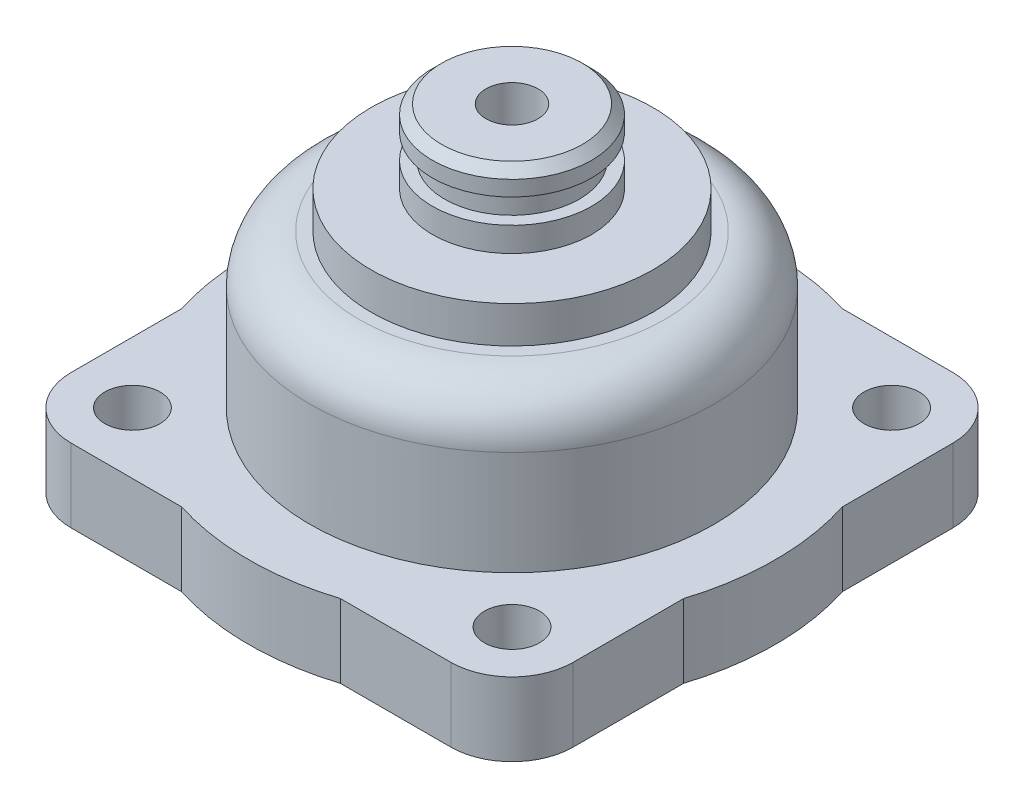
ISO-10303-21;
HEADER;
FILE_DESCRIPTION(('STEP AP214'),'2;1');
FILE_NAME('part.step','',(''),(''),'','','');
FILE_SCHEMA(('AUTOMOTIVE_DESIGN { 1 0 10303 214 1 1 1 1 }'));
ENDSEC;
DATA;
#1=APPLICATION_CONTEXT('core data for automotive mechanical design processes');
#2=APPLICATION_PROTOCOL_DEFINITION('international standard','automotive_design',2000,#1);
#3=PRODUCT_CONTEXT('',#1,'mechanical');
#4=PRODUCT('Part','Part','',(#3));
#5=PRODUCT_RELATED_PRODUCT_CATEGORY('part','',(#4));
#6=PRODUCT_DEFINITION_FORMATION('','',#4);
#7=PRODUCT_DEFINITION_CONTEXT('part definition',#1,'design');
#8=PRODUCT_DEFINITION('design','',#6,#7);
#9=PRODUCT_DEFINITION_SHAPE('','',#8);
#10=(LENGTH_UNIT() NAMED_UNIT(*) SI_UNIT(.MILLI.,.METRE.));
#11=(NAMED_UNIT(*) PLANE_ANGLE_UNIT() SI_UNIT($,.RADIAN.));
#12=(NAMED_UNIT(*) SI_UNIT($,.STERADIAN.) SOLID_ANGLE_UNIT());
#13=UNCERTAINTY_MEASURE_WITH_UNIT(LENGTH_MEASURE(1.E-05),#10,'distance_accuracy_value','');
#14=(GEOMETRIC_REPRESENTATION_CONTEXT(3) GLOBAL_UNCERTAINTY_ASSIGNED_CONTEXT((#13)) GLOBAL_UNIT_ASSIGNED_CONTEXT((#10,
#11,#12)) REPRESENTATION_CONTEXT('',''));
#15=CARTESIAN_POINT('',(0.,0.,0.));
#16=DIRECTION('',(0.,0.,1.));
#17=DIRECTION('',(1.,0.,0.));
#18=AXIS2_PLACEMENT_3D('',#15,#16,#17);
#19=CARTESIAN_POINT('',(0.,12.,0.));
#20=DIRECTION('',(0.,1.,0.));
#21=DIRECTION('',(0.,0.,1.));
#22=AXIS2_PLACEMENT_3D('',#19,#20,#21);
#23=PLANE('',#22);
#24=CARTESIAN_POINT('',(0.,12.,0.));
#25=DIRECTION('',(0.,-1.,0.));
#26=DIRECTION('',(1.,0.,0.));
#27=AXIS2_PLACEMENT_3D('',#24,#25,#26);
#28=CIRCLE('',#27,33.);
#29=CARTESIAN_POINT('',(33.,12.,0.));
#30=VERTEX_POINT('',#29);
#31=EDGE_CURVE('E385',#30,#30,#28,.T.);
#32=ORIENTED_EDGE('',*,*,#31,.T.);
#33=EDGE_LOOP('',(#32));
#34=FACE_BOUND('',#33,.T.);
#35=CARTESIAN_POINT('',(31.,12.,31.));
#36=DIRECTION('',(0.,1.,0.));
#37=DIRECTION('',(0.,0.,1.));
#38=AXIS2_PLACEMENT_3D('',#35,#36,#37);
#39=CIRCLE('',#38,4.50000000000061);
#40=CARTESIAN_POINT('',(31.,12.,35.5000000000006));
#41=VERTEX_POINT('',#40);
#42=EDGE_CURVE('E400',#41,#41,#39,.T.);
#43=ORIENTED_EDGE('',*,*,#42,.F.);
#44=EDGE_LOOP('',(#43));
#45=FACE_BOUND('',#44,.T.);
#46=CARTESIAN_POINT('',(-31.,12.,-31.));
#47=DIRECTION('',(0.,1.,0.));
#48=DIRECTION('',(0.,0.,1.));
#49=AXIS2_PLACEMENT_3D('',#46,#47,#48);
#50=CIRCLE('',#49,4.5);
#51=CARTESIAN_POINT('',(-31.,12.,-26.5));
#52=VERTEX_POINT('',#51);
#53=EDGE_CURVE('E197',#52,#52,#50,.T.);
#54=ORIENTED_EDGE('',*,*,#53,.F.);
#55=EDGE_LOOP('',(#54));
#56=FACE_BOUND('',#55,.T.);
#57=CARTESIAN_POINT('',(0.,12.,0.));
#58=DIRECTION('',(0.,1.,0.));
#59=DIRECTION('',(0.,0.,1.));
#60=AXIS2_PLACEMENT_3D('',#57,#58,#59);
#61=CIRCLE('',#60,43.);
#62=CARTESIAN_POINT('',(-41.,12.,-12.9614813968157));
#63=VERTEX_POINT('',#62);
#64=CARTESIAN_POINT('',(-41.,12.,12.9614813968157));
#65=VERTEX_POINT('',#64);
#66=EDGE_CURVE('E224',#63,#65,#61,.T.);
#67=ORIENTED_EDGE('',*,*,#66,.T.);
#68=DIRECTION('',(0.,0.,1.));
#69=VECTOR('',#68,1.);
#70=CARTESIAN_POINT('',(-41.,12.,30.9999999999999));
#71=LINE('',#70,#69);
#72=CARTESIAN_POINT('',(-41.,12.,30.9999999999999));
#73=VERTEX_POINT('',#72);
#74=EDGE_CURVE('E132',#65,#73,#71,.T.);
#75=ORIENTED_EDGE('',*,*,#74,.T.);
#76=CARTESIAN_POINT('',(-31.,12.,31.));
#77=DIRECTION('',(0.,1.,0.));
#78=DIRECTION('',(0.,0.,-1.));
#79=AXIS2_PLACEMENT_3D('',#76,#77,#78);
#80=CIRCLE('',#79,10.);
#81=CARTESIAN_POINT('',(-30.9999999999999,12.,41.));
#82=VERTEX_POINT('',#81);
#83=EDGE_CURVE('E418',#73,#82,#80,.T.);
#84=ORIENTED_EDGE('',*,*,#83,.T.);
#85=DIRECTION('',(1.,0.,0.));
#86=VECTOR('',#85,1.);
#87=CARTESIAN_POINT('',(-30.9999999999999,12.,41.));
#88=LINE('',#87,#86);
#89=CARTESIAN_POINT('',(-12.9614813968157,12.,41.));
#90=VERTEX_POINT('',#89);
#91=EDGE_CURVE('E420',#82,#90,#88,.T.);
#92=ORIENTED_EDGE('',*,*,#91,.T.);
#93=CARTESIAN_POINT('',(0.,12.,0.));
#94=DIRECTION('',(0.,1.,0.));
#95=DIRECTION('',(0.,0.,1.));
#96=AXIS2_PLACEMENT_3D('',#93,#94,#95);
#97=CIRCLE('',#96,43.);
#98=CARTESIAN_POINT('',(12.9614813968157,12.,41.));
#99=VERTEX_POINT('',#98);
#100=EDGE_CURVE('E422',#90,#99,#97,.T.);
#101=ORIENTED_EDGE('',*,*,#100,.T.);
#102=DIRECTION('',(1.,0.,0.));
#103=VECTOR('',#102,1.);
#104=CARTESIAN_POINT('',(12.9614813968157,12.,41.));
#105=LINE('',#104,#103);
#106=CARTESIAN_POINT('',(30.9999999999999,12.,41.));
#107=VERTEX_POINT('',#106);
#108=EDGE_CURVE('E424',#99,#107,#105,.T.);
#109=ORIENTED_EDGE('',*,*,#108,.T.);
#110=CARTESIAN_POINT('',(31.,12.,31.));
#111=DIRECTION('',(0.,1.,0.));
#112=DIRECTION('',(0.,0.,1.));
#113=AXIS2_PLACEMENT_3D('',#110,#111,#112);
#114=CIRCLE('',#113,10.);
#115=CARTESIAN_POINT('',(41.,12.,30.9999999999999));
#116=VERTEX_POINT('',#115);
#117=EDGE_CURVE('E426',#107,#116,#114,.T.);
#118=ORIENTED_EDGE('',*,*,#117,.T.);
#119=DIRECTION('',(0.,0.,-1.));
#120=VECTOR('',#119,1.);
#121=CARTESIAN_POINT('',(41.,12.,30.9999999999999));
#122=LINE('',#121,#120);
#123=CARTESIAN_POINT('',(41.,12.,12.9614813968157));
#124=VERTEX_POINT('',#123);
#125=EDGE_CURVE('E428',#116,#124,#122,.T.);
#126=ORIENTED_EDGE('',*,*,#125,.T.);
#127=CARTESIAN_POINT('',(0.,12.,0.));
#128=DIRECTION('',(0.,1.,0.));
#129=DIRECTION('',(0.,0.,1.));
#130=AXIS2_PLACEMENT_3D('',#127,#128,#129);
#131=CIRCLE('',#130,43.);
#132=CARTESIAN_POINT('',(41.,12.,-12.9614813968157));
#133=VERTEX_POINT('',#132);
#134=EDGE_CURVE('E430',#124,#133,#131,.T.);
#135=ORIENTED_EDGE('',*,*,#134,.T.);
#136=DIRECTION('',(0.,0.,-1.));
#137=VECTOR('',#136,1.);
#138=CARTESIAN_POINT('',(41.,12.,-12.9614813968157));
#139=LINE('',#138,#137);
#140=CARTESIAN_POINT('',(41.,12.,-30.9999999999999));
#141=VERTEX_POINT('',#140);
#142=EDGE_CURVE('E432',#133,#141,#139,.T.);
#143=ORIENTED_EDGE('',*,*,#142,.T.);
#144=CARTESIAN_POINT('',(31.,12.,-31.));
#145=DIRECTION('',(0.,1.,0.));
#146=DIRECTION('',(0.,0.,-1.));
#147=AXIS2_PLACEMENT_3D('',#144,#145,#146);
#148=CIRCLE('',#147,10.);
#149=CARTESIAN_POINT('',(30.9999999999999,12.,-41.));
#150=VERTEX_POINT('',#149);
#151=EDGE_CURVE('E434',#141,#150,#148,.T.);
#152=ORIENTED_EDGE('',*,*,#151,.T.);
#153=DIRECTION('',(-1.,0.,0.));
#154=VECTOR('',#153,1.);
#155=CARTESIAN_POINT('',(12.9614813968157,12.,-41.));
#156=LINE('',#155,#154);
#157=CARTESIAN_POINT('',(12.9614813968157,12.,-41.));
#158=VERTEX_POINT('',#157);
#159=EDGE_CURVE('E436',#150,#158,#156,.T.);
#160=ORIENTED_EDGE('',*,*,#159,.T.);
#161=CARTESIAN_POINT('',(0.,12.,0.));
#162=DIRECTION('',(0.,1.,0.));
#163=DIRECTION('',(0.,0.,1.));
#164=AXIS2_PLACEMENT_3D('',#161,#162,#163);
#165=CIRCLE('',#164,43.);
#166=CARTESIAN_POINT('',(-12.9614813968157,12.,-41.));
#167=VERTEX_POINT('',#166);
#168=EDGE_CURVE('E175',#158,#167,#165,.T.);
#169=ORIENTED_EDGE('',*,*,#168,.T.);
#170=DIRECTION('',(-1.,0.,0.));
#171=VECTOR('',#170,1.);
#172=CARTESIAN_POINT('',(-30.9999999999999,12.,-41.));
#173=LINE('',#172,#171);
#174=CARTESIAN_POINT('',(-30.9999999999999,12.,-41.));
#175=VERTEX_POINT('',#174);
#176=EDGE_CURVE('E169',#167,#175,#173,.T.);
#177=ORIENTED_EDGE('',*,*,#176,.T.);
#178=CARTESIAN_POINT('',(-31.,12.,-31.));
#179=DIRECTION('',(0.,1.,0.));
#180=DIRECTION('',(0.,0.,-1.));
#181=AXIS2_PLACEMENT_3D('',#178,#179,#180);
#182=CIRCLE('',#181,10.);
#183=CARTESIAN_POINT('',(-41.,12.,-30.9999999999999));
#184=VERTEX_POINT('',#183);
#185=EDGE_CURVE('E173',#175,#184,#182,.T.);
#186=ORIENTED_EDGE('',*,*,#185,.T.);
#187=DIRECTION('',(0.,0.,1.));
#188=VECTOR('',#187,1.);
#189=CARTESIAN_POINT('',(-41.,12.,-12.9614813968157));
#190=LINE('',#189,#188);
#191=EDGE_CURVE('E64',#184,#63,#190,.T.);
#192=ORIENTED_EDGE('',*,*,#191,.T.);
#193=EDGE_LOOP('',(#67,#75,#84,#92,#101,#109,#118,#126,#135,#143,#152,#160,#169,#177,#186,#192));
#194=FACE_BOUND('',#193,.T.);
#195=CARTESIAN_POINT('',(31.,12.,-31.));
#196=DIRECTION('',(0.,1.,0.));
#197=DIRECTION('',(0.,0.,1.));
#198=AXIS2_PLACEMENT_3D('',#195,#196,#197);
#199=CIRCLE('',#198,4.5);
#200=CARTESIAN_POINT('',(31.,12.,-26.5));
#201=VERTEX_POINT('',#200);
#202=EDGE_CURVE('E406',#201,#201,#199,.T.);
#203=ORIENTED_EDGE('',*,*,#202,.F.);
#204=EDGE_LOOP('',(#203));
#205=FACE_BOUND('',#204,.T.);
#206=CARTESIAN_POINT('',(-30.9999999999993,12.,31.));
#207=DIRECTION('',(0.,1.,0.));
#208=DIRECTION('',(0.,0.,1.));
#209=AXIS2_PLACEMENT_3D('',#206,#207,#208);
#210=CIRCLE('',#209,4.5);
#211=CARTESIAN_POINT('',(-30.9999999999993,12.,35.5));
#212=VERTEX_POINT('',#211);
#213=EDGE_CURVE('E390',#212,#212,#210,.T.);
#214=ORIENTED_EDGE('',*,*,#213,.F.);
#215=EDGE_LOOP('',(#214));
#216=FACE_BOUND('',#215,.T.);
#217=ADVANCED_FACE('F47',(#34,#45,#56,#194,#205,#216),#23,.T.);
#218=CARTESIAN_POINT('',(0.,0.,0.));
#219=DIRECTION('',(0.,1.,0.));
#220=DIRECTION('',(0.,0.,1.));
#221=AXIS2_PLACEMENT_3D('',#218,#219,#220);
#222=PLANE('',#221);
#223=CARTESIAN_POINT('',(0.,0.,0.));
#224=DIRECTION('',(0.,-1.,0.));
#225=DIRECTION('',(0.,0.,-1.));
#226=AXIS2_PLACEMENT_3D('',#223,#224,#225);
#227=CIRCLE('',#226,25.);
#228=CARTESIAN_POINT('',(0.,0.,-25.));
#229=VERTEX_POINT('',#228);
#230=EDGE_CURVE('E786',#229,#229,#227,.T.);
#231=ORIENTED_EDGE('',*,*,#230,.F.);
#232=EDGE_LOOP('',(#231));
#233=FACE_BOUND('',#232,.T.);
#234=CARTESIAN_POINT('',(0.,0.,0.));
#235=DIRECTION('',(0.,1.,0.));
#236=DIRECTION('',(0.,0.,1.));
#237=AXIS2_PLACEMENT_3D('',#234,#235,#236);
#238=CIRCLE('',#237,43.);
#239=CARTESIAN_POINT('',(-41.,0.,-12.9614813968157));
#240=VERTEX_POINT('',#239);
#241=CARTESIAN_POINT('',(-41.,0.,12.9614813968157));
#242=VERTEX_POINT('',#241);
#243=EDGE_CURVE('E193',#240,#242,#238,.T.);
#244=ORIENTED_EDGE('',*,*,#243,.F.);
#245=DIRECTION('',(0.,0.,1.));
#246=VECTOR('',#245,1.);
#247=CARTESIAN_POINT('',(-41.,0.,-12.9614813968157));
#248=LINE('',#247,#246);
#249=CARTESIAN_POINT('',(-41.,0.,-30.9999999999999));
#250=VERTEX_POINT('',#249);
#251=EDGE_CURVE('E123',#250,#240,#248,.T.);
#252=ORIENTED_EDGE('',*,*,#251,.F.);
#253=CARTESIAN_POINT('',(-31.,0.,-31.));
#254=DIRECTION('',(0.,1.,0.));
#255=DIRECTION('',(0.,0.,-1.));
#256=AXIS2_PLACEMENT_3D('',#253,#254,#255);
#257=CIRCLE('',#256,10.);
#258=CARTESIAN_POINT('',(-30.9999999999999,0.,-41.));
#259=VERTEX_POINT('',#258);
#260=EDGE_CURVE('E117',#259,#250,#257,.T.);
#261=ORIENTED_EDGE('',*,*,#260,.F.);
#262=DIRECTION('',(-1.,0.,0.));
#263=VECTOR('',#262,1.);
#264=CARTESIAN_POINT('',(-30.9999999999999,0.,-41.));
#265=LINE('',#264,#263);
#266=CARTESIAN_POINT('',(-12.9614813968157,0.,-41.));
#267=VERTEX_POINT('',#266);
#268=EDGE_CURVE('E183',#267,#259,#265,.T.);
#269=ORIENTED_EDGE('',*,*,#268,.F.);
#270=CARTESIAN_POINT('',(0.,0.,0.));
#271=DIRECTION('',(0.,1.,0.));
#272=DIRECTION('',(0.,0.,1.));
#273=AXIS2_PLACEMENT_3D('',#270,#271,#272);
#274=CIRCLE('',#273,43.);
#275=CARTESIAN_POINT('',(12.9614813968157,0.,-41.));
#276=VERTEX_POINT('',#275);
#277=EDGE_CURVE('E219',#276,#267,#274,.T.);
#278=ORIENTED_EDGE('',*,*,#277,.F.);
#279=DIRECTION('',(-1.,0.,0.));
#280=VECTOR('',#279,1.);
#281=CARTESIAN_POINT('',(12.9614813968157,0.,-41.));
#282=LINE('',#281,#280);
#283=CARTESIAN_POINT('',(30.9999999999999,0.,-41.));
#284=VERTEX_POINT('',#283);
#285=EDGE_CURVE('E217',#284,#276,#282,.T.);
#286=ORIENTED_EDGE('',*,*,#285,.F.);
#287=CARTESIAN_POINT('',(31.,0.,-31.));
#288=DIRECTION('',(0.,1.,0.));
#289=DIRECTION('',(0.,0.,-1.));
#290=AXIS2_PLACEMENT_3D('',#287,#288,#289);
#291=CIRCLE('',#290,10.);
#292=CARTESIAN_POINT('',(41.,0.,-30.9999999999999));
#293=VERTEX_POINT('',#292);
#294=EDGE_CURVE('E215',#293,#284,#291,.T.);
#295=ORIENTED_EDGE('',*,*,#294,.F.);
#296=DIRECTION('',(0.,0.,-1.));
#297=VECTOR('',#296,1.);
#298=CARTESIAN_POINT('',(41.,0.,-12.9614813968157));
#299=LINE('',#298,#297);
#300=CARTESIAN_POINT('',(41.,0.,-12.9614813968157));
#301=VERTEX_POINT('',#300);
#302=EDGE_CURVE('E213',#301,#293,#299,.T.);
#303=ORIENTED_EDGE('',*,*,#302,.F.);
#304=CARTESIAN_POINT('',(0.,0.,0.));
#305=DIRECTION('',(0.,1.,0.));
#306=DIRECTION('',(0.,0.,1.));
#307=AXIS2_PLACEMENT_3D('',#304,#305,#306);
#308=CIRCLE('',#307,43.);
#309=CARTESIAN_POINT('',(41.,0.,12.9614813968157));
#310=VERTEX_POINT('',#309);
#311=EDGE_CURVE('E211',#310,#301,#308,.T.);
#312=ORIENTED_EDGE('',*,*,#311,.F.);
#313=DIRECTION('',(0.,0.,-1.));
#314=VECTOR('',#313,1.);
#315=CARTESIAN_POINT('',(41.,0.,30.9999999999999));
#316=LINE('',#315,#314);
#317=CARTESIAN_POINT('',(41.,0.,30.9999999999999));
#318=VERTEX_POINT('',#317);
#319=EDGE_CURVE('E209',#318,#310,#316,.T.);
#320=ORIENTED_EDGE('',*,*,#319,.F.);
#321=CARTESIAN_POINT('',(31.,0.,31.));
#322=DIRECTION('',(0.,1.,0.));
#323=DIRECTION('',(0.,0.,1.));
#324=AXIS2_PLACEMENT_3D('',#321,#322,#323);
#325=CIRCLE('',#324,10.);
#326=CARTESIAN_POINT('',(30.9999999999999,0.,41.));
#327=VERTEX_POINT('',#326);
#328=EDGE_CURVE('E207',#327,#318,#325,.T.);
#329=ORIENTED_EDGE('',*,*,#328,.F.);
#330=DIRECTION('',(1.,0.,0.));
#331=VECTOR('',#330,1.);
#332=CARTESIAN_POINT('',(12.9614813968157,0.,41.));
#333=LINE('',#332,#331);
#334=CARTESIAN_POINT('',(12.9614813968157,0.,41.));
#335=VERTEX_POINT('',#334);
#336=EDGE_CURVE('E205',#335,#327,#333,.T.);
#337=ORIENTED_EDGE('',*,*,#336,.F.);
#338=CARTESIAN_POINT('',(0.,0.,0.));
#339=DIRECTION('',(0.,1.,0.));
#340=DIRECTION('',(0.,0.,1.));
#341=AXIS2_PLACEMENT_3D('',#338,#339,#340);
#342=CIRCLE('',#341,43.);
#343=CARTESIAN_POINT('',(-12.9614813968157,0.,41.));
#344=VERTEX_POINT('',#343);
#345=EDGE_CURVE('E203',#344,#335,#342,.T.);
#346=ORIENTED_EDGE('',*,*,#345,.F.);
#347=DIRECTION('',(1.,0.,0.));
#348=VECTOR('',#347,1.);
#349=CARTESIAN_POINT('',(-30.9999999999999,0.,41.));
#350=LINE('',#349,#348);
#351=CARTESIAN_POINT('',(-30.9999999999999,0.,41.));
#352=VERTEX_POINT('',#351);
#353=EDGE_CURVE('E201',#352,#344,#350,.T.);
#354=ORIENTED_EDGE('',*,*,#353,.F.);
#355=CARTESIAN_POINT('',(-31.,0.,31.));
#356=DIRECTION('',(0.,1.,0.));
#357=DIRECTION('',(0.,0.,-1.));
#358=AXIS2_PLACEMENT_3D('',#355,#356,#357);
#359=CIRCLE('',#358,10.);
#360=CARTESIAN_POINT('',(-41.,0.,30.9999999999999));
#361=VERTEX_POINT('',#360);
#362=EDGE_CURVE('E199',#361,#352,#359,.T.);
#363=ORIENTED_EDGE('',*,*,#362,.F.);
#364=DIRECTION('',(0.,0.,1.));
#365=VECTOR('',#364,1.);
#366=CARTESIAN_POINT('',(-41.,0.,30.9999999999999));
#367=LINE('',#366,#365);
#368=EDGE_CURVE('E196',#242,#361,#367,.T.);
#369=ORIENTED_EDGE('',*,*,#368,.F.);
#370=EDGE_LOOP('',(#244,#252,#261,#269,#278,#286,#295,#303,#312,#320,#329,#337,#346,#354,#363,#369));
#371=FACE_BOUND('',#370,.T.);
#372=CARTESIAN_POINT('',(-31.,0.,-31.));
#373=DIRECTION('',(0.,1.,0.));
#374=DIRECTION('',(0.,0.,1.));
#375=AXIS2_PLACEMENT_3D('',#372,#373,#374);
#376=CIRCLE('',#375,4.5);
#377=CARTESIAN_POINT('',(-31.,0.,-26.5));
#378=VERTEX_POINT('',#377);
#379=EDGE_CURVE('E409',#378,#378,#376,.T.);
#380=ORIENTED_EDGE('',*,*,#379,.T.);
#381=EDGE_LOOP('',(#380));
#382=FACE_BOUND('',#381,.T.);
#383=CARTESIAN_POINT('',(31.,0.,-31.));
#384=DIRECTION('',(0.,1.,0.));
#385=DIRECTION('',(0.,0.,1.));
#386=AXIS2_PLACEMENT_3D('',#383,#384,#385);
#387=CIRCLE('',#386,4.5);
#388=CARTESIAN_POINT('',(31.,0.,-26.5));
#389=VERTEX_POINT('',#388);
#390=EDGE_CURVE('E403',#389,#389,#387,.T.);
#391=ORIENTED_EDGE('',*,*,#390,.T.);
#392=EDGE_LOOP('',(#391));
#393=FACE_BOUND('',#392,.T.);
#394=CARTESIAN_POINT('',(31.,0.,31.));
#395=DIRECTION('',(0.,1.,0.));
#396=DIRECTION('',(0.,0.,1.));
#397=AXIS2_PLACEMENT_3D('',#394,#395,#396);
#398=CIRCLE('',#397,4.50000000000061);
#399=CARTESIAN_POINT('',(31.,0.,35.5000000000006));
#400=VERTEX_POINT('',#399);
#401=EDGE_CURVE('E398',#400,#400,#398,.T.);
#402=ORIENTED_EDGE('',*,*,#401,.T.);
#403=EDGE_LOOP('',(#402));
#404=FACE_BOUND('',#403,.T.);
#405=CARTESIAN_POINT('',(-30.9999999999993,0.,31.));
#406=DIRECTION('',(0.,1.,0.));
#407=DIRECTION('',(0.,0.,1.));
#408=AXIS2_PLACEMENT_3D('',#405,#406,#407);
#409=CIRCLE('',#408,4.5);
#410=CARTESIAN_POINT('',(-30.9999999999993,0.,35.5));
#411=VERTEX_POINT('',#410);
#412=EDGE_CURVE('E386',#411,#411,#409,.T.);
#413=ORIENTED_EDGE('',*,*,#412,.T.);
#414=EDGE_LOOP('',(#413));
#415=FACE_BOUND('',#414,.T.);
#416=ADVANCED_FACE('F289',(#233,#371,#382,#393,#404,#415),#222,.F.);
#417=CARTESIAN_POINT('',(0.,12.,0.));
#418=DIRECTION('',(0.,-1.,0.));
#419=DIRECTION('',(0.,0.,-1.));
#420=AXIS2_PLACEMENT_3D('',#417,#418,#419);
#421=CYLINDRICAL_SURFACE('',#420,43.);
#422=ORIENTED_EDGE('',*,*,#243,.T.);
#423=DIRECTION('',(0.,-1.,0.));
#424=VECTOR('',#423,1.);
#425=CARTESIAN_POINT('',(-41.,12.,12.9614813968157));
#426=LINE('',#425,#424);
#427=EDGE_CURVE('E261',#65,#242,#426,.T.);
#428=ORIENTED_EDGE('',*,*,#427,.F.);
#429=ORIENTED_EDGE('',*,*,#66,.F.);
#430=DIRECTION('',(0.,-1.,0.));
#431=VECTOR('',#430,1.);
#432=CARTESIAN_POINT('',(-41.,12.,-12.9614813968157));
#433=LINE('',#432,#431);
#434=EDGE_CURVE('E189',#63,#240,#433,.T.);
#435=ORIENTED_EDGE('',*,*,#434,.T.);
#436=EDGE_LOOP('',(#422,#428,#429,#435));
#437=FACE_BOUND('',#436,.T.);
#438=ADVANCED_FACE('F297',(#437),#421,.T.);
#439=CARTESIAN_POINT('',(-41.,12.,30.9999999999999));
#440=DIRECTION('',(1.,0.,0.));
#441=DIRECTION('',(0.,0.,-1.));
#442=AXIS2_PLACEMENT_3D('',#439,#440,#441);
#443=PLANE('',#442);
#444=ORIENTED_EDGE('',*,*,#368,.T.);
#445=DIRECTION('',(0.,-1.,0.));
#446=VECTOR('',#445,1.);
#447=CARTESIAN_POINT('',(-41.,12.,30.9999999999999));
#448=LINE('',#447,#446);
#449=EDGE_CURVE('E258',#73,#361,#448,.T.);
#450=ORIENTED_EDGE('',*,*,#449,.F.);
#451=ORIENTED_EDGE('',*,*,#74,.F.);
#452=ORIENTED_EDGE('',*,*,#427,.T.);
#453=EDGE_LOOP('',(#444,#450,#451,#452));
#454=FACE_BOUND('',#453,.T.);
#455=ADVANCED_FACE('F356',(#454),#443,.F.);
#456=CARTESIAN_POINT('',(-31.,12.,31.));
#457=DIRECTION('',(0.,-1.,0.));
#458=DIRECTION('',(0.,0.,-1.));
#459=AXIS2_PLACEMENT_3D('',#456,#457,#458);
#460=CYLINDRICAL_SURFACE('',#459,10.);
#461=ORIENTED_EDGE('',*,*,#362,.T.);
#462=DIRECTION('',(0.,-1.,0.));
#463=VECTOR('',#462,1.);
#464=CARTESIAN_POINT('',(-30.9999999999999,12.,41.));
#465=LINE('',#464,#463);
#466=EDGE_CURVE('E255',#82,#352,#465,.T.);
#467=ORIENTED_EDGE('',*,*,#466,.F.);
#468=ORIENTED_EDGE('',*,*,#83,.F.);
#469=ORIENTED_EDGE('',*,*,#449,.T.);
#470=EDGE_LOOP('',(#461,#467,#468,#469));
#471=FACE_BOUND('',#470,.T.);
#472=ADVANCED_FACE('F352',(#471),#460,.T.);
#473=CARTESIAN_POINT('',(-30.9999999999999,12.,41.));
#474=DIRECTION('',(0.,0.,-1.));
#475=DIRECTION('',(-1.,0.,0.));
#476=AXIS2_PLACEMENT_3D('',#473,#474,#475);
#477=PLANE('',#476);
#478=ORIENTED_EDGE('',*,*,#353,.T.);
#479=DIRECTION('',(0.,-1.,0.));
#480=VECTOR('',#479,1.);
#481=CARTESIAN_POINT('',(-12.9614813968157,12.,41.));
#482=LINE('',#481,#480);
#483=EDGE_CURVE('E252',#90,#344,#482,.T.);
#484=ORIENTED_EDGE('',*,*,#483,.F.);
#485=ORIENTED_EDGE('',*,*,#91,.F.);
#486=ORIENTED_EDGE('',*,*,#466,.T.);
#487=EDGE_LOOP('',(#478,#484,#485,#486));
#488=FACE_BOUND('',#487,.T.);
#489=ADVANCED_FACE('F348',(#488),#477,.F.);
#490=CARTESIAN_POINT('',(0.,12.,0.));
#491=DIRECTION('',(0.,-1.,0.));
#492=DIRECTION('',(0.,0.,-1.));
#493=AXIS2_PLACEMENT_3D('',#490,#491,#492);
#494=CYLINDRICAL_SURFACE('',#493,43.);
#495=ORIENTED_EDGE('',*,*,#345,.T.);
#496=DIRECTION('',(0.,-1.,0.));
#497=VECTOR('',#496,1.);
#498=CARTESIAN_POINT('',(12.9614813968157,12.,41.));
#499=LINE('',#498,#497);
#500=EDGE_CURVE('E249',#99,#335,#499,.T.);
#501=ORIENTED_EDGE('',*,*,#500,.F.);
#502=ORIENTED_EDGE('',*,*,#100,.F.);
#503=ORIENTED_EDGE('',*,*,#483,.T.);
#504=EDGE_LOOP('',(#495,#501,#502,#503));
#505=FACE_BOUND('',#504,.T.);
#506=ADVANCED_FACE('F344',(#505),#494,.T.);
#507=CARTESIAN_POINT('',(12.9614813968157,12.,41.));
#508=DIRECTION('',(0.,0.,-1.));
#509=DIRECTION('',(-1.,0.,0.));
#510=AXIS2_PLACEMENT_3D('',#507,#508,#509);
#511=PLANE('',#510);
#512=ORIENTED_EDGE('',*,*,#336,.T.);
#513=DIRECTION('',(0.,-1.,0.));
#514=VECTOR('',#513,1.);
#515=CARTESIAN_POINT('',(30.9999999999999,12.,41.));
#516=LINE('',#515,#514);
#517=EDGE_CURVE('E246',#107,#327,#516,.T.);
#518=ORIENTED_EDGE('',*,*,#517,.F.);
#519=ORIENTED_EDGE('',*,*,#108,.F.);
#520=ORIENTED_EDGE('',*,*,#500,.T.);
#521=EDGE_LOOP('',(#512,#518,#519,#520));
#522=FACE_BOUND('',#521,.T.);
#523=ADVANCED_FACE('F340',(#522),#511,.F.);
#524=CARTESIAN_POINT('',(31.,12.,31.));
#525=DIRECTION('',(0.,-1.,0.));
#526=DIRECTION('',(0.,0.,-1.));
#527=AXIS2_PLACEMENT_3D('',#524,#525,#526);
#528=CYLINDRICAL_SURFACE('',#527,10.);
#529=ORIENTED_EDGE('',*,*,#328,.T.);
#530=DIRECTION('',(0.,-1.,0.));
#531=VECTOR('',#530,1.);
#532=CARTESIAN_POINT('',(41.,12.,30.9999999999999));
#533=LINE('',#532,#531);
#534=EDGE_CURVE('E243',#116,#318,#533,.T.);
#535=ORIENTED_EDGE('',*,*,#534,.F.);
#536=ORIENTED_EDGE('',*,*,#117,.F.);
#537=ORIENTED_EDGE('',*,*,#517,.T.);
#538=EDGE_LOOP('',(#529,#535,#536,#537));
#539=FACE_BOUND('',#538,.T.);
#540=ADVANCED_FACE('F336',(#539),#528,.T.);
#541=CARTESIAN_POINT('',(41.,12.,30.9999999999999));
#542=DIRECTION('',(-1.,0.,0.));
#543=DIRECTION('',(0.,0.,1.));
#544=AXIS2_PLACEMENT_3D('',#541,#542,#543);
#545=PLANE('',#544);
#546=ORIENTED_EDGE('',*,*,#319,.T.);
#547=DIRECTION('',(0.,-1.,0.));
#548=VECTOR('',#547,1.);
#549=CARTESIAN_POINT('',(41.,12.,12.9614813968157));
#550=LINE('',#549,#548);
#551=EDGE_CURVE('E240',#124,#310,#550,.T.);
#552=ORIENTED_EDGE('',*,*,#551,.F.);
#553=ORIENTED_EDGE('',*,*,#125,.F.);
#554=ORIENTED_EDGE('',*,*,#534,.T.);
#555=EDGE_LOOP('',(#546,#552,#553,#554));
#556=FACE_BOUND('',#555,.T.);
#557=ADVANCED_FACE('F332',(#556),#545,.F.);
#558=CARTESIAN_POINT('',(0.,12.,0.));
#559=DIRECTION('',(0.,-1.,0.));
#560=DIRECTION('',(0.,0.,-1.));
#561=AXIS2_PLACEMENT_3D('',#558,#559,#560);
#562=CYLINDRICAL_SURFACE('',#561,43.);
#563=ORIENTED_EDGE('',*,*,#311,.T.);
#564=DIRECTION('',(0.,-1.,0.));
#565=VECTOR('',#564,1.);
#566=CARTESIAN_POINT('',(41.,12.,-12.9614813968157));
#567=LINE('',#566,#565);
#568=EDGE_CURVE('E237',#133,#301,#567,.T.);
#569=ORIENTED_EDGE('',*,*,#568,.F.);
#570=ORIENTED_EDGE('',*,*,#134,.F.);
#571=ORIENTED_EDGE('',*,*,#551,.T.);
#572=EDGE_LOOP('',(#563,#569,#570,#571));
#573=FACE_BOUND('',#572,.T.);
#574=ADVANCED_FACE('F328',(#573),#562,.T.);
#575=CARTESIAN_POINT('',(41.,12.,-12.9614813968157));
#576=DIRECTION('',(-1.,0.,0.));
#577=DIRECTION('',(0.,0.,1.));
#578=AXIS2_PLACEMENT_3D('',#575,#576,#577);
#579=PLANE('',#578);
#580=ORIENTED_EDGE('',*,*,#302,.T.);
#581=DIRECTION('',(0.,-1.,0.));
#582=VECTOR('',#581,1.);
#583=CARTESIAN_POINT('',(41.,12.,-30.9999999999999));
#584=LINE('',#583,#582);
#585=EDGE_CURVE('E234',#141,#293,#584,.T.);
#586=ORIENTED_EDGE('',*,*,#585,.F.);
#587=ORIENTED_EDGE('',*,*,#142,.F.);
#588=ORIENTED_EDGE('',*,*,#568,.T.);
#589=EDGE_LOOP('',(#580,#586,#587,#588));
#590=FACE_BOUND('',#589,.T.);
#591=ADVANCED_FACE('F324',(#590),#579,.F.);
#592=CARTESIAN_POINT('',(31.,12.,-31.));
#593=DIRECTION('',(0.,-1.,0.));
#594=DIRECTION('',(0.,0.,-1.));
#595=AXIS2_PLACEMENT_3D('',#592,#593,#594);
#596=CYLINDRICAL_SURFACE('',#595,10.);
#597=ORIENTED_EDGE('',*,*,#294,.T.);
#598=DIRECTION('',(0.,-1.,0.));
#599=VECTOR('',#598,1.);
#600=CARTESIAN_POINT('',(30.9999999999999,12.,-41.));
#601=LINE('',#600,#599);
#602=EDGE_CURVE('E231',#150,#284,#601,.T.);
#603=ORIENTED_EDGE('',*,*,#602,.F.);
#604=ORIENTED_EDGE('',*,*,#151,.F.);
#605=ORIENTED_EDGE('',*,*,#585,.T.);
#606=EDGE_LOOP('',(#597,#603,#604,#605));
#607=FACE_BOUND('',#606,.T.);
#608=ADVANCED_FACE('F320',(#607),#596,.T.);
#609=CARTESIAN_POINT('',(12.9614813968157,12.,-41.));
#610=DIRECTION('',(0.,0.,1.));
#611=DIRECTION('',(1.,0.,0.));
#612=AXIS2_PLACEMENT_3D('',#609,#610,#611);
#613=PLANE('',#612);
#614=ORIENTED_EDGE('',*,*,#285,.T.);
#615=DIRECTION('',(0.,-1.,0.));
#616=VECTOR('',#615,1.);
#617=CARTESIAN_POINT('',(12.9614813968157,12.,-41.));
#618=LINE('',#617,#616);
#619=EDGE_CURVE('E228',#158,#276,#618,.T.);
#620=ORIENTED_EDGE('',*,*,#619,.F.);
#621=ORIENTED_EDGE('',*,*,#159,.F.);
#622=ORIENTED_EDGE('',*,*,#602,.T.);
#623=EDGE_LOOP('',(#614,#620,#621,#622));
#624=FACE_BOUND('',#623,.T.);
#625=ADVANCED_FACE('F316',(#624),#613,.F.);
#626=CARTESIAN_POINT('',(0.,12.,0.));
#627=DIRECTION('',(0.,-1.,0.));
#628=DIRECTION('',(0.,0.,-1.));
#629=AXIS2_PLACEMENT_3D('',#626,#627,#628);
#630=CYLINDRICAL_SURFACE('',#629,43.);
#631=ORIENTED_EDGE('',*,*,#277,.T.);
#632=DIRECTION('',(0.,-1.,0.));
#633=VECTOR('',#632,1.);
#634=CARTESIAN_POINT('',(-12.9614813968157,12.,-41.));
#635=LINE('',#634,#633);
#636=EDGE_CURVE('E184',#167,#267,#635,.T.);
#637=ORIENTED_EDGE('',*,*,#636,.F.);
#638=ORIENTED_EDGE('',*,*,#168,.F.);
#639=ORIENTED_EDGE('',*,*,#619,.T.);
#640=EDGE_LOOP('',(#631,#637,#638,#639));
#641=FACE_BOUND('',#640,.T.);
#642=ADVANCED_FACE('F313',(#641),#630,.T.);
#643=CARTESIAN_POINT('',(-30.9999999999999,12.,-41.));
#644=DIRECTION('',(0.,0.,1.));
#645=DIRECTION('',(1.,0.,0.));
#646=AXIS2_PLACEMENT_3D('',#643,#644,#645);
#647=PLANE('',#646);
#648=ORIENTED_EDGE('',*,*,#268,.T.);
#649=DIRECTION('',(0.,-1.,0.));
#650=VECTOR('',#649,1.);
#651=CARTESIAN_POINT('',(-30.9999999999999,12.,-41.));
#652=LINE('',#651,#650);
#653=EDGE_CURVE('E180',#175,#259,#652,.T.);
#654=ORIENTED_EDGE('',*,*,#653,.F.);
#655=ORIENTED_EDGE('',*,*,#176,.F.);
#656=ORIENTED_EDGE('',*,*,#636,.T.);
#657=EDGE_LOOP('',(#648,#654,#655,#656));
#658=FACE_BOUND('',#657,.T.);
#659=ADVANCED_FACE('F181',(#658),#647,.F.);
#660=CARTESIAN_POINT('',(-31.,12.,-31.));
#661=DIRECTION('',(0.,-1.,0.));
#662=DIRECTION('',(0.,0.,-1.));
#663=AXIS2_PLACEMENT_3D('',#660,#661,#662);
#664=CYLINDRICAL_SURFACE('',#663,10.);
#665=ORIENTED_EDGE('',*,*,#260,.T.);
#666=DIRECTION('',(0.,-1.,0.));
#667=VECTOR('',#666,1.);
#668=CARTESIAN_POINT('',(-41.,12.,-30.9999999999999));
#669=LINE('',#668,#667);
#670=EDGE_CURVE('E185',#184,#250,#669,.T.);
#671=ORIENTED_EDGE('',*,*,#670,.F.);
#672=ORIENTED_EDGE('',*,*,#185,.F.);
#673=ORIENTED_EDGE('',*,*,#653,.T.);
#674=EDGE_LOOP('',(#665,#671,#672,#673));
#675=FACE_BOUND('',#674,.T.);
#676=ADVANCED_FACE('F187',(#675),#664,.T.);
#677=CARTESIAN_POINT('',(-41.,12.,-12.9614813968157));
#678=DIRECTION('',(1.,0.,0.));
#679=DIRECTION('',(0.,0.,-1.));
#680=AXIS2_PLACEMENT_3D('',#677,#678,#679);
#681=PLANE('',#680);
#682=ORIENTED_EDGE('',*,*,#251,.T.);
#683=ORIENTED_EDGE('',*,*,#434,.F.);
#684=ORIENTED_EDGE('',*,*,#191,.F.);
#685=ORIENTED_EDGE('',*,*,#670,.T.);
#686=EDGE_LOOP('',(#682,#683,#684,#685));
#687=FACE_BOUND('',#686,.T.);
#688=ADVANCED_FACE('F306',(#687),#681,.F.);
#689=CARTESIAN_POINT('',(-31.,12.,-31.));
#690=DIRECTION('',(0.,-1.,0.));
#691=DIRECTION('',(0.,0.,-1.));
#692=AXIS2_PLACEMENT_3D('',#689,#690,#691);
#693=CYLINDRICAL_SURFACE('',#692,4.5);
#694=ORIENTED_EDGE('',*,*,#53,.T.);
#695=EDGE_LOOP('',(#694));
#696=FACE_BOUND('',#695,.T.);
#697=ORIENTED_EDGE('',*,*,#379,.F.);
#698=EDGE_LOOP('',(#697));
#699=FACE_BOUND('',#698,.T.);
#700=ADVANCED_FACE('F303',(#696,#699),#693,.F.);
#701=CARTESIAN_POINT('',(31.,12.,-31.));
#702=DIRECTION('',(0.,-1.,0.));
#703=DIRECTION('',(0.,0.,-1.));
#704=AXIS2_PLACEMENT_3D('',#701,#702,#703);
#705=CYLINDRICAL_SURFACE('',#704,4.5);
#706=ORIENTED_EDGE('',*,*,#202,.T.);
#707=EDGE_LOOP('',(#706));
#708=FACE_BOUND('',#707,.T.);
#709=ORIENTED_EDGE('',*,*,#390,.F.);
#710=EDGE_LOOP('',(#709));
#711=FACE_BOUND('',#710,.T.);
#712=ADVANCED_FACE('F487',(#708,#711),#705,.F.);
#713=CARTESIAN_POINT('',(31.,12.,31.));
#714=DIRECTION('',(0.,-1.,0.));
#715=DIRECTION('',(0.,0.,-1.));
#716=AXIS2_PLACEMENT_3D('',#713,#714,#715);
#717=CYLINDRICAL_SURFACE('',#716,4.50000000000061);
#718=ORIENTED_EDGE('',*,*,#42,.T.);
#719=EDGE_LOOP('',(#718));
#720=FACE_BOUND('',#719,.T.);
#721=ORIENTED_EDGE('',*,*,#401,.F.);
#722=EDGE_LOOP('',(#721));
#723=FACE_BOUND('',#722,.T.);
#724=ADVANCED_FACE('F481',(#720,#723),#717,.F.);
#725=CARTESIAN_POINT('',(-30.9999999999993,12.,31.));
#726=DIRECTION('',(0.,-1.,0.));
#727=DIRECTION('',(0.,0.,-1.));
#728=AXIS2_PLACEMENT_3D('',#725,#726,#727);
#729=CYLINDRICAL_SURFACE('',#728,4.5);
#730=ORIENTED_EDGE('',*,*,#213,.T.);
#731=EDGE_LOOP('',(#730));
#732=FACE_BOUND('',#731,.T.);
#733=ORIENTED_EDGE('',*,*,#412,.F.);
#734=EDGE_LOOP('',(#733));
#735=FACE_BOUND('',#734,.T.);
#736=ADVANCED_FACE('F382',(#732,#735),#729,.F.);
#737=CARTESIAN_POINT('',(0.,12.,0.));
#738=DIRECTION('',(0.,-1.,0.));
#739=DIRECTION('',(1.,0.,0.));
#740=AXIS2_PLACEMENT_3D('',#737,#738,#739);
#741=CYLINDRICAL_SURFACE('',#740,33.);
#742=CARTESIAN_POINT('',(0.,29.,0.));
#743=DIRECTION('',(0.,1.,0.));
#744=DIRECTION('',(-1.,0.,0.));
#745=AXIS2_PLACEMENT_3D('',#742,#743,#744);
#746=CIRCLE('',#745,33.);
#747=CARTESIAN_POINT('',(-33.,29.,0.));
#748=VERTEX_POINT('',#747);
#749=EDGE_CURVE('E263',#748,#748,#746,.F.);
#750=ORIENTED_EDGE('',*,*,#749,.T.);
#751=EDGE_LOOP('',(#750));
#752=FACE_BOUND('',#751,.T.);
#753=ORIENTED_EDGE('',*,*,#31,.F.);
#754=EDGE_LOOP('',(#753));
#755=FACE_BOUND('',#754,.T.);
#756=ADVANCED_FACE('F378',(#752,#755),#741,.T.);
#757=CARTESIAN_POINT('',(33.,37.,0.));
#758=DIRECTION('',(0.,1.,0.));
#759=DIRECTION('',(-1.,0.,0.));
#760=AXIS2_PLACEMENT_3D('',#757,#758,#759);
#761=PLANE('',#760);
#762=CARTESIAN_POINT('',(0.,37.,0.));
#763=DIRECTION('',(0.,1.,0.));
#764=DIRECTION('',(-1.,0.,0.));
#765=AXIS2_PLACEMENT_3D('',#762,#763,#764);
#766=CIRCLE('',#765,25.);
#767=CARTESIAN_POINT('',(-25.,37.,0.));
#768=VERTEX_POINT('',#767);
#769=EDGE_CURVE('E266',#768,#768,#766,.T.);
#770=ORIENTED_EDGE('',*,*,#769,.T.);
#771=EDGE_LOOP('',(#770));
#772=FACE_BOUND('',#771,.T.);
#773=CARTESIAN_POINT('',(0.,37.,0.));
#774=DIRECTION('',(0.,-1.,0.));
#775=DIRECTION('',(1.,0.,0.));
#776=AXIS2_PLACEMENT_3D('',#773,#774,#775);
#777=CIRCLE('',#776,23.);
#778=CARTESIAN_POINT('',(23.,37.,0.));
#779=VERTEX_POINT('',#778);
#780=EDGE_CURVE('E387',#779,#779,#777,.T.);
#781=ORIENTED_EDGE('',*,*,#780,.T.);
#782=EDGE_LOOP('',(#781));
#783=FACE_BOUND('',#782,.T.);
#784=ADVANCED_FACE('F381',(#772,#783),#761,.T.);
#785=CARTESIAN_POINT('',(0.,12.,0.));
#786=DIRECTION('',(0.,-1.,0.));
#787=DIRECTION('',(1.,0.,0.));
#788=AXIS2_PLACEMENT_3D('',#785,#786,#787);
#789=CYLINDRICAL_SURFACE('',#788,23.);
#790=CARTESIAN_POINT('',(0.,43.,0.));
#791=DIRECTION('',(0.,-1.,0.));
#792=DIRECTION('',(1.,0.,0.));
#793=AXIS2_PLACEMENT_3D('',#790,#791,#792);
#794=CIRCLE('',#793,23.);
#795=CARTESIAN_POINT('',(23.,43.,0.));
#796=VERTEX_POINT('',#795);
#797=EDGE_CURVE('E393',#796,#796,#794,.T.);
#798=ORIENTED_EDGE('',*,*,#797,.T.);
#799=EDGE_LOOP('',(#798));
#800=FACE_BOUND('',#799,.T.);
#801=ORIENTED_EDGE('',*,*,#780,.F.);
#802=EDGE_LOOP('',(#801));
#803=FACE_BOUND('',#802,.T.);
#804=ADVANCED_FACE('F703',(#800,#803),#789,.T.);
#805=CARTESIAN_POINT('',(23.,43.,0.));
#806=DIRECTION('',(0.,1.,0.));
#807=DIRECTION('',(-1.,0.,0.));
#808=AXIS2_PLACEMENT_3D('',#805,#806,#807);
#809=PLANE('',#808);
#810=CARTESIAN_POINT('',(0.,43.,0.));
#811=DIRECTION('',(0.,-1.,0.));
#812=DIRECTION('',(1.,0.,0.));
#813=AXIS2_PLACEMENT_3D('',#810,#811,#812);
#814=CIRCLE('',#813,13.);
#815=CARTESIAN_POINT('',(13.,43.,0.));
#816=VERTEX_POINT('',#815);
#817=EDGE_CURVE('E764',#816,#816,#814,.T.);
#818=ORIENTED_EDGE('',*,*,#817,.T.);
#819=EDGE_LOOP('',(#818));
#820=FACE_BOUND('',#819,.T.);
#821=ORIENTED_EDGE('',*,*,#797,.F.);
#822=EDGE_LOOP('',(#821));
#823=FACE_BOUND('',#822,.T.);
#824=ADVANCED_FACE('F693',(#820,#823),#809,.T.);
#825=CARTESIAN_POINT('',(0.,12.,0.));
#826=DIRECTION('',(0.,-1.,0.));
#827=DIRECTION('',(1.,0.,0.));
#828=AXIS2_PLACEMENT_3D('',#825,#826,#827);
#829=CYLINDRICAL_SURFACE('',#828,13.);
#830=CARTESIAN_POINT('',(0.,47.,0.));
#831=DIRECTION('',(0.,-1.,0.));
#832=DIRECTION('',(1.,0.,0.));
#833=AXIS2_PLACEMENT_3D('',#830,#831,#832);
#834=CIRCLE('',#833,13.);
#835=CARTESIAN_POINT('',(13.,47.,0.));
#836=VERTEX_POINT('',#835);
#837=EDGE_CURVE('E766',#836,#836,#834,.T.);
#838=ORIENTED_EDGE('',*,*,#837,.T.);
#839=EDGE_LOOP('',(#838));
#840=FACE_BOUND('',#839,.T.);
#841=ORIENTED_EDGE('',*,*,#817,.F.);
#842=EDGE_LOOP('',(#841));
#843=FACE_BOUND('',#842,.T.);
#844=ADVANCED_FACE('F683',(#840,#843),#829,.T.);
#845=CARTESIAN_POINT('',(13.,47.,0.));
#846=DIRECTION('',(0.,1.,0.));
#847=DIRECTION('',(-1.,0.,0.));
#848=AXIS2_PLACEMENT_3D('',#845,#846,#847);
#849=PLANE('',#848);
#850=CARTESIAN_POINT('',(0.,47.,0.));
#851=DIRECTION('',(0.,-1.,0.));
#852=DIRECTION('',(1.,0.,0.));
#853=AXIS2_PLACEMENT_3D('',#850,#851,#852);
#854=CIRCLE('',#853,11.);
#855=CARTESIAN_POINT('',(11.,47.,0.));
#856=VERTEX_POINT('',#855);
#857=EDGE_CURVE('E771',#856,#856,#854,.T.);
#858=ORIENTED_EDGE('',*,*,#857,.T.);
#859=EDGE_LOOP('',(#858));
#860=FACE_BOUND('',#859,.T.);
#861=ORIENTED_EDGE('',*,*,#837,.F.);
#862=EDGE_LOOP('',(#861));
#863=FACE_BOUND('',#862,.T.);
#864=ADVANCED_FACE('F673',(#860,#863),#849,.T.);
#865=CARTESIAN_POINT('',(0.,12.,0.));
#866=DIRECTION('',(0.,-1.,0.));
#867=DIRECTION('',(1.,0.,0.));
#868=AXIS2_PLACEMENT_3D('',#865,#866,#867);
#869=CYLINDRICAL_SURFACE('',#868,11.);
#870=CARTESIAN_POINT('',(0.,51.,0.));
#871=DIRECTION('',(0.,-1.,0.));
#872=DIRECTION('',(1.,0.,0.));
#873=AXIS2_PLACEMENT_3D('',#870,#871,#872);
#874=CIRCLE('',#873,11.);
#875=CARTESIAN_POINT('',(11.,51.,0.));
#876=VERTEX_POINT('',#875);
#877=EDGE_CURVE('E774',#876,#876,#874,.T.);
#878=ORIENTED_EDGE('',*,*,#877,.T.);
#879=EDGE_LOOP('',(#878));
#880=FACE_BOUND('',#879,.T.);
#881=ORIENTED_EDGE('',*,*,#857,.F.);
#882=EDGE_LOOP('',(#881));
#883=FACE_BOUND('',#882,.T.);
#884=ADVANCED_FACE('F663',(#880,#883),#869,.T.);
#885=CARTESIAN_POINT('',(11.,51.,0.));
#886=DIRECTION('',(0.,-1.,0.));
#887=DIRECTION('',(1.,0.,0.));
#888=AXIS2_PLACEMENT_3D('',#885,#886,#887);
#889=PLANE('',#888);
#890=CARTESIAN_POINT('',(0.,51.,0.));
#891=DIRECTION('',(0.,-1.,0.));
#892=DIRECTION('',(1.,0.,0.));
#893=AXIS2_PLACEMENT_3D('',#890,#891,#892);
#894=CIRCLE('',#893,13.);
#895=CARTESIAN_POINT('',(13.,51.,0.));
#896=VERTEX_POINT('',#895);
#897=EDGE_CURVE('E777',#896,#896,#894,.T.);
#898=ORIENTED_EDGE('',*,*,#897,.T.);
#899=EDGE_LOOP('',(#898));
#900=FACE_BOUND('',#899,.T.);
#901=ORIENTED_EDGE('',*,*,#877,.F.);
#902=EDGE_LOOP('',(#901));
#903=FACE_BOUND('',#902,.T.);
#904=ADVANCED_FACE('F653',(#900,#903),#889,.T.);
#905=CARTESIAN_POINT('',(0.,12.,0.));
#906=DIRECTION('',(0.,-1.,0.));
#907=DIRECTION('',(1.,0.,0.));
#908=AXIS2_PLACEMENT_3D('',#905,#906,#907);
#909=CYLINDRICAL_SURFACE('',#908,13.);
#910=CARTESIAN_POINT('',(0.,53.5,0.));
#911=DIRECTION('',(0.,-1.,0.));
#912=DIRECTION('',(1.,0.,0.));
#913=AXIS2_PLACEMENT_3D('',#910,#911,#912);
#914=CIRCLE('',#913,13.);
#915=CARTESIAN_POINT('',(13.,53.5,0.));
#916=VERTEX_POINT('',#915);
#917=EDGE_CURVE('E780',#916,#916,#914,.T.);
#918=ORIENTED_EDGE('',*,*,#917,.T.);
#919=EDGE_LOOP('',(#918));
#920=FACE_BOUND('',#919,.T.);
#921=ORIENTED_EDGE('',*,*,#897,.F.);
#922=EDGE_LOOP('',(#921));
#923=FACE_BOUND('',#922,.T.);
#924=ADVANCED_FACE('F643',(#920,#923),#909,.T.);
#925=CARTESIAN_POINT('',(0.,53.5,0.));
#926=DIRECTION('',(0.,-1.,0.));
#927=DIRECTION('',(1.,0.,0.));
#928=AXIS2_PLACEMENT_3D('',#925,#926,#927);
#929=CONICAL_SURFACE('',#928,13.,0.785398163397447);
#930=CARTESIAN_POINT('',(0.,55.,0.));
#931=DIRECTION('',(0.,-1.,0.));
#932=DIRECTION('',(1.,0.,0.));
#933=AXIS2_PLACEMENT_3D('',#930,#931,#932);
#934=CIRCLE('',#933,11.5);
#935=CARTESIAN_POINT('',(11.5,55.,0.));
#936=VERTEX_POINT('',#935);
#937=EDGE_CURVE('E783',#936,#936,#934,.T.);
#938=ORIENTED_EDGE('',*,*,#937,.T.);
#939=EDGE_LOOP('',(#938));
#940=FACE_BOUND('',#939,.T.);
#941=ORIENTED_EDGE('',*,*,#917,.F.);
#942=EDGE_LOOP('',(#941));
#943=FACE_BOUND('',#942,.T.);
#944=ADVANCED_FACE('F371',(#940,#943),#929,.T.);
#945=CARTESIAN_POINT('',(11.5,55.,0.));
#946=DIRECTION('',(0.,1.,0.));
#947=DIRECTION('',(-1.,0.,0.));
#948=AXIS2_PLACEMENT_3D('',#945,#946,#947);
#949=PLANE('',#948);
#950=CARTESIAN_POINT('',(0.,55.,0.));
#951=DIRECTION('',(0.,1.,0.));
#952=DIRECTION('',(0.,0.,1.));
#953=AXIS2_PLACEMENT_3D('',#950,#951,#952);
#954=CIRCLE('',#953,4.25);
#955=CARTESIAN_POINT('',(0.,55.,4.25));
#956=VERTEX_POINT('',#955);
#957=EDGE_CURVE('E792',#956,#956,#954,.T.);
#958=ORIENTED_EDGE('',*,*,#957,.F.);
#959=EDGE_LOOP('',(#958));
#960=FACE_BOUND('',#959,.T.);
#961=ORIENTED_EDGE('',*,*,#937,.F.);
#962=EDGE_LOOP('',(#961));
#963=FACE_BOUND('',#962,.T.);
#964=ADVANCED_FACE('F364',(#960,#963),#949,.T.);
#965=CARTESIAN_POINT('',(0.,29.,0.));
#966=DIRECTION('',(0.,1.,0.));
#967=DIRECTION('',(-1.,0.,0.));
#968=AXIS2_PLACEMENT_3D('',#965,#966,#967);
#969=TOROIDAL_SURFACE('',#968,25.,8.);
#970=ORIENTED_EDGE('',*,*,#769,.F.);
#971=EDGE_LOOP('',(#970));
#972=FACE_BOUND('',#971,.T.);
#973=ORIENTED_EDGE('',*,*,#749,.F.);
#974=EDGE_LOOP('',(#973));
#975=FACE_BOUND('',#974,.T.);
#976=ADVANCED_FACE('F362',(#972,#975),#969,.T.);
#977=CARTESIAN_POINT('',(0.,29.,0.));
#978=DIRECTION('',(0.,-1.,0.));
#979=DIRECTION('',(0.,0.,-1.));
#980=AXIS2_PLACEMENT_3D('',#977,#978,#979);
#981=CYLINDRICAL_SURFACE('',#980,25.);
#982=CARTESIAN_POINT('',(0.,27.,0.));
#983=DIRECTION('',(0.,-1.,0.));
#984=DIRECTION('',(0.,0.,-1.));
#985=AXIS2_PLACEMENT_3D('',#982,#983,#984);
#986=CIRCLE('',#985,25.);
#987=CARTESIAN_POINT('',(0.,27.,-25.));
#988=VERTEX_POINT('',#987);
#989=EDGE_CURVE('E11',#988,#988,#986,.F.);
#990=CARTESIAN_POINT('',(0.,27.,-25.));
#991=CARTESIAN_POINT('',(0.,26.71875,-25.));
#992=CARTESIAN_POINT('',(0.,26.4375,-25.));
#993=CARTESIAN_POINT('',(0.,25.875,-25.));
#994=CARTESIAN_POINT('',(0.,25.59375,-25.));
#995=CARTESIAN_POINT('',(0.,25.03125,-25.));
#996=CARTESIAN_POINT('',(0.,24.75,-25.));
#997=CARTESIAN_POINT('',(0.,24.1875,-25.));
#998=CARTESIAN_POINT('',(0.,23.90625,-25.));
#999=CARTESIAN_POINT('',(0.,23.34375,-25.));
#1000=CARTESIAN_POINT('',(0.,23.0625,-25.));
#1001=CARTESIAN_POINT('',(0.,22.5,-25.));
#1002=CARTESIAN_POINT('',(0.,22.21875,-25.));
#1003=CARTESIAN_POINT('',(0.,21.65625,-25.));
#1004=CARTESIAN_POINT('',(0.,21.375,-25.));
#1005=CARTESIAN_POINT('',(0.,20.8125,-25.));
#1006=CARTESIAN_POINT('',(0.,20.53125,-25.));
#1007=CARTESIAN_POINT('',(0.,19.96875,-25.));
#1008=CARTESIAN_POINT('',(0.,19.6875,-25.));
#1009=CARTESIAN_POINT('',(0.,19.125,-25.));
#1010=CARTESIAN_POINT('',(0.,18.84375,-25.));
#1011=CARTESIAN_POINT('',(0.,18.28125,-25.));
#1012=CARTESIAN_POINT('',(0.,18.,-25.));
#1013=CARTESIAN_POINT('',(0.,17.4375,-25.));
#1014=CARTESIAN_POINT('',(0.,17.15625,-25.));
#1015=CARTESIAN_POINT('',(0.,16.59375,-25.));
#1016=CARTESIAN_POINT('',(0.,16.3125,-25.));
#1017=CARTESIAN_POINT('',(0.,15.75,-25.));
#1018=CARTESIAN_POINT('',(0.,15.46875,-25.));
#1019=CARTESIAN_POINT('',(0.,14.90625,-25.));
#1020=CARTESIAN_POINT('',(0.,14.625,-25.));
#1021=CARTESIAN_POINT('',(0.,14.0625,-25.));
#1022=CARTESIAN_POINT('',(0.,13.78125,-25.));
#1023=CARTESIAN_POINT('',(0.,13.21875,-25.));
#1024=CARTESIAN_POINT('',(0.,12.9375,-25.));
#1025=CARTESIAN_POINT('',(0.,12.375,-25.));
#1026=CARTESIAN_POINT('',(0.,12.09375,-25.));
#1027=CARTESIAN_POINT('',(0.,11.53125,-25.));
#1028=CARTESIAN_POINT('',(0.,11.25,-25.));
#1029=CARTESIAN_POINT('',(0.,10.6875,-25.));
#1030=CARTESIAN_POINT('',(0.,10.40625,-25.));
#1031=CARTESIAN_POINT('',(0.,9.84375,-25.));
#1032=CARTESIAN_POINT('',(0.,9.5625,-25.));
#1033=CARTESIAN_POINT('',(0.,9.,-25.));
#1034=CARTESIAN_POINT('',(0.,8.71875,-25.));
#1035=CARTESIAN_POINT('',(0.,8.15625,-25.));
#1036=CARTESIAN_POINT('',(0.,7.875,-25.));
#1037=CARTESIAN_POINT('',(0.,7.3125,-25.));
#1038=CARTESIAN_POINT('',(0.,7.03125,-25.));
#1039=CARTESIAN_POINT('',(0.,6.46875,-25.));
#1040=CARTESIAN_POINT('',(0.,6.1875,-25.));
#1041=CARTESIAN_POINT('',(0.,5.625,-25.));
#1042=CARTESIAN_POINT('',(0.,5.34375,-25.));
#1043=CARTESIAN_POINT('',(0.,4.78125,-25.));
#1044=CARTESIAN_POINT('',(0.,4.5,-25.));
#1045=CARTESIAN_POINT('',(0.,3.9375,-25.));
#1046=CARTESIAN_POINT('',(0.,3.65625,-25.));
#1047=CARTESIAN_POINT('',(0.,3.09375,-25.));
#1048=CARTESIAN_POINT('',(0.,2.8125,-25.));
#1049=CARTESIAN_POINT('',(0.,2.25,-25.));
#1050=CARTESIAN_POINT('',(0.,1.96875,-25.));
#1051=CARTESIAN_POINT('',(0.,1.40625,-25.));
#1052=CARTESIAN_POINT('',(0.,1.125,-25.));
#1053=CARTESIAN_POINT('',(0.,0.562499999999998,-25.));
#1054=CARTESIAN_POINT('',(0.,0.281249999999999,-25.));
#1055=CARTESIAN_POINT('',(0.,0.,-25.));
#1056=B_SPLINE_CURVE_WITH_KNOTS('',3,(#990,#991,#992,#993,#994,#995,#996,#997,#998,#999,#1000,
#1001,#1002,#1003,#1004,#1005,#1006,#1007,#1008,#1009,#1010,#1011,#1012,#1013,#1014,#1015,#1016,
#1017,#1018,#1019,#1020,#1021,#1022,#1023,#1024,#1025,#1026,#1027,#1028,#1029,#1030,#1031,#1032,
#1033,#1034,#1035,#1036,#1037,#1038,#1039,#1040,#1041,#1042,#1043,#1044,#1045,#1046,#1047,#1048,
#1049,#1050,#1051,#1052,#1053,#1054,#1055),.UNSPECIFIED.,.F.,.F.,(4,2,2,2,2,2,2,2,2,2,2,2,2,2,2,
2,2,2,2,2,2,2,2,2,2,2,2,2,2,2,2,2,4),(0.,0.843750000000001,1.6875,2.53125,3.375,4.21875,5.0625,
5.90625,6.75,7.59375,8.4375,9.28125,10.125,10.96875,11.8125,12.65625,13.5,14.34375,15.1875,
16.03125,16.875,17.71875,18.5625,19.40625,20.25,21.09375,21.9375,22.78125,23.625,24.46875,
25.3125,26.15625,27.),.UNSPECIFIED.);
#1057=EDGE_CURVE('BSEAM284',#988,#229,#1056,.T.);
#1058=ORIENTED_EDGE('',*,*,#989,.T.);
#1059=ORIENTED_EDGE('',*,*,#230,.T.);
#1060=ORIENTED_EDGE('',*,*,#1057,.T.);
#1061=ORIENTED_EDGE('',*,*,#1057,.F.);
#1062=EDGE_LOOP('',(#1058,#1060,#1059,#1061));
#1063=FACE_BOUND('',#1062,.T.);
#1064=ADVANCED_FACE('F284',(#1063),#981,.F.);
#1065=CARTESIAN_POINT('',(0.,29.,0.));
#1066=DIRECTION('',(0.,-1.,0.));
#1067=DIRECTION('',(0.,0.,-1.));
#1068=AXIS2_PLACEMENT_3D('',#1065,#1066,#1067);
#1069=PLANE('',#1068);
#1070=CARTESIAN_POINT('',(0.,29.,0.));
#1071=DIRECTION('',(0.,-1.,0.));
#1072=DIRECTION('',(0.,0.,-1.));
#1073=AXIS2_PLACEMENT_3D('',#1070,#1071,#1072);
#1074=CIRCLE('',#1073,4.25);
#1075=CARTESIAN_POINT('',(0.,29.,-4.25));
#1076=VERTEX_POINT('',#1075);
#1077=EDGE_CURVE('E789',#1076,#1076,#1074,.T.);
#1078=ORIENTED_EDGE('',*,*,#1077,.F.);
#1079=EDGE_LOOP('',(#1078));
#1080=FACE_BOUND('',#1079,.T.);
#1081=CARTESIAN_POINT('',(0.,29.,0.));
#1082=DIRECTION('',(0.,-1.,0.));
#1083=DIRECTION('',(0.,0.,-1.));
#1084=AXIS2_PLACEMENT_3D('',#1081,#1082,#1083);
#1085=CIRCLE('',#1084,23.);
#1086=CARTESIAN_POINT('',(0.,29.,-23.));
#1087=VERTEX_POINT('',#1086);
#1088=EDGE_CURVE('E56',#1087,#1087,#1085,.T.);
#1089=ORIENTED_EDGE('',*,*,#1088,.T.);
#1090=EDGE_LOOP('',(#1089));
#1091=FACE_BOUND('',#1090,.T.);
#1092=ADVANCED_FACE('F271',(#1080,#1091),#1069,.T.);
#1093=CARTESIAN_POINT('',(0.,27.,0.));
#1094=DIRECTION('',(0.,-1.,0.));
#1095=DIRECTION('',(0.,0.,-1.));
#1096=AXIS2_PLACEMENT_3D('',#1093,#1094,#1095);
#1097=TOROIDAL_SURFACE('',#1096,23.,2.);
#1098=ORIENTED_EDGE('',*,*,#989,.F.);
#1099=EDGE_LOOP('',(#1098));
#1100=FACE_BOUND('',#1099,.T.);
#1101=ORIENTED_EDGE('',*,*,#1088,.F.);
#1102=EDGE_LOOP('',(#1101));
#1103=FACE_BOUND('',#1102,.T.);
#1104=ADVANCED_FACE('F49',(#1100,#1103),#1097,.F.);
#1105=CARTESIAN_POINT('',(0.,55.,0.));
#1106=DIRECTION('',(0.,1.,0.));
#1107=DIRECTION('',(0.,0.,1.));
#1108=AXIS2_PLACEMENT_3D('',#1105,#1106,#1107);
#1109=CYLINDRICAL_SURFACE('',#1108,4.25);
#1110=ORIENTED_EDGE('',*,*,#957,.T.);
#1111=EDGE_LOOP('',(#1110));
#1112=FACE_BOUND('',#1111,.T.);
#1113=ORIENTED_EDGE('',*,*,#1077,.T.);
#1114=EDGE_LOOP('',(#1113));
#1115=FACE_BOUND('',#1114,.T.);
#1116=ADVANCED_FACE('F274',(#1112,#1115),#1109,.F.);
#1117=CLOSED_SHELL('',(#217,#416,#438,#455,#472,#489,#506,#523,#540,#557,#574,#591,#608,#625,
#642,#659,#676,#688,#700,#712,#724,#736,#756,#784,#804,#824,#844,#864,#884,#904,#924,#944,#964,
#976,#1064,#1092,#1104,#1116));
#1118=MANIFOLD_SOLID_BREP('B2',#1117);
#1119=ADVANCED_BREP_SHAPE_REPRESENTATION('',(#18,#1118),#14);
#1120=SHAPE_DEFINITION_REPRESENTATION(#9,#1119);
ENDSEC;
END-ISO-10303-21;
